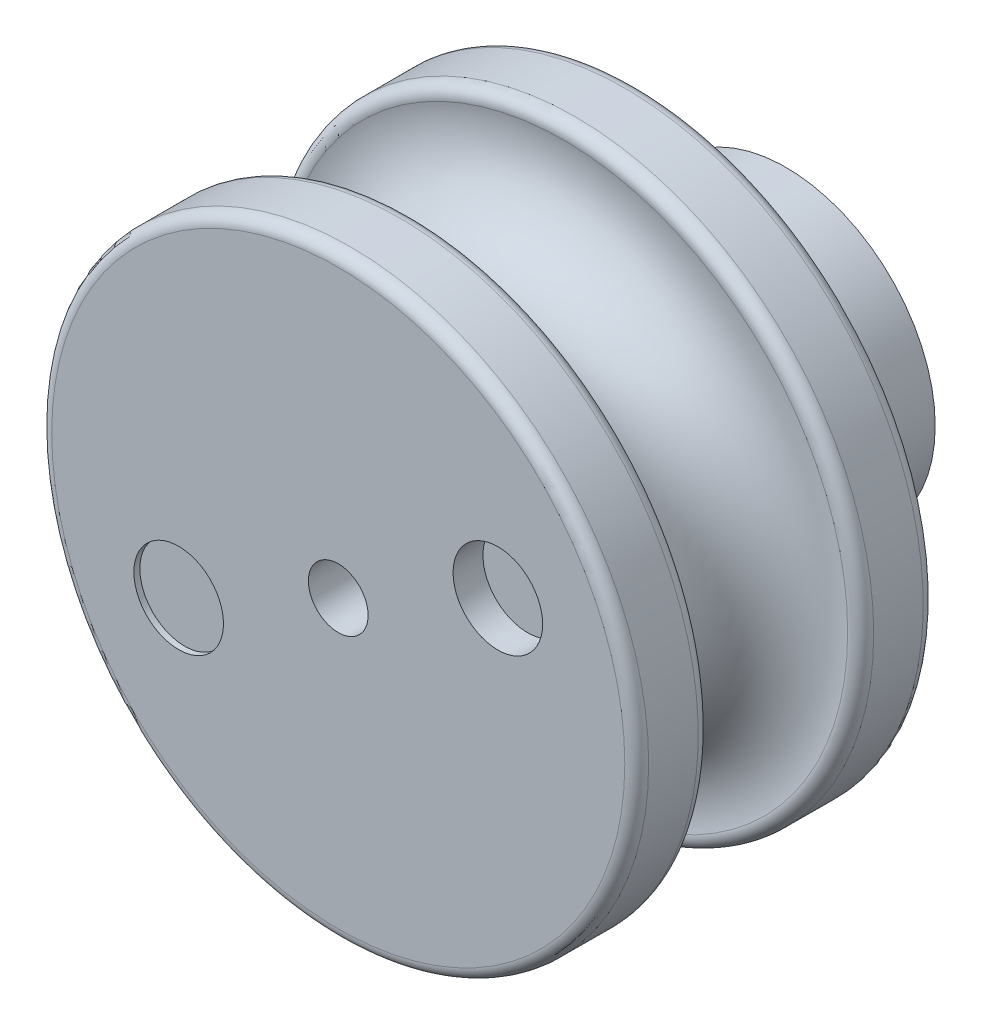
ISO-10303-21;
HEADER;
FILE_DESCRIPTION(('STEP AP214'),'2;1');
FILE_NAME('part.step','',(''),(''),'','','');
FILE_SCHEMA(('AUTOMOTIVE_DESIGN { 1 0 10303 214 1 1 1 1 }'));
ENDSEC;
DATA;
#1=APPLICATION_CONTEXT('core data for automotive mechanical design processes');
#2=APPLICATION_PROTOCOL_DEFINITION('international standard','automotive_design',2000,#1);
#3=PRODUCT_CONTEXT('',#1,'mechanical');
#4=PRODUCT('Part','Part','',(#3));
#5=PRODUCT_RELATED_PRODUCT_CATEGORY('part','',(#4));
#6=PRODUCT_DEFINITION_FORMATION('','',#4);
#7=PRODUCT_DEFINITION_CONTEXT('part definition',#1,'design');
#8=PRODUCT_DEFINITION('design','',#6,#7);
#9=PRODUCT_DEFINITION_SHAPE('','',#8);
#10=(LENGTH_UNIT() NAMED_UNIT(*) SI_UNIT(.MILLI.,.METRE.));
#11=(NAMED_UNIT(*) PLANE_ANGLE_UNIT() SI_UNIT($,.RADIAN.));
#12=(NAMED_UNIT(*) SI_UNIT($,.STERADIAN.) SOLID_ANGLE_UNIT());
#13=UNCERTAINTY_MEASURE_WITH_UNIT(LENGTH_MEASURE(1.E-05),#10,'distance_accuracy_value','');
#14=(GEOMETRIC_REPRESENTATION_CONTEXT(3) GLOBAL_UNCERTAINTY_ASSIGNED_CONTEXT((#13)) GLOBAL_UNIT_ASSIGNED_CONTEXT((#10,
#11,#12)) REPRESENTATION_CONTEXT('',''));
#15=CARTESIAN_POINT('',(0.,0.,0.));
#16=DIRECTION('',(0.,0.,1.));
#17=DIRECTION('',(1.,0.,0.));
#18=AXIS2_PLACEMENT_3D('',#15,#16,#17);
#19=CARTESIAN_POINT('',(0.,0.,-1.5));
#20=DIRECTION('',(0.,0.,1.));
#21=DIRECTION('',(1.,0.,0.));
#22=AXIS2_PLACEMENT_3D('',#19,#20,#21);
#23=CYLINDRICAL_SURFACE('',#22,2.5);
#24=CARTESIAN_POINT('',(0.,0.,0.));
#25=DIRECTION('',(0.,0.,1.));
#26=DIRECTION('',(1.,0.,0.));
#27=AXIS2_PLACEMENT_3D('',#24,#25,#26);
#28=CIRCLE('',#27,2.5);
#29=CARTESIAN_POINT('',(2.5,0.,0.));
#30=VERTEX_POINT('',#29);
#31=EDGE_CURVE('E179',#30,#30,#28,.T.);
#32=ORIENTED_EDGE('',*,*,#31,.F.);
#33=EDGE_LOOP('',(#32));
#34=FACE_BOUND('',#33,.T.);
#35=CARTESIAN_POINT('',(0.,0.,-2.5));
#36=DIRECTION('',(0.,0.,-1.));
#37=DIRECTION('',(-0.990268068741566,0.139173100960095,0.));
#38=AXIS2_PLACEMENT_3D('',#35,#36,#37);
#39=CIRCLE('',#38,2.5);
#40=CARTESIAN_POINT('',(-2.47567017185392,0.347932752400238,-2.5));
#41=VERTEX_POINT('',#40);
#42=EDGE_CURVE('E10',#41,#41,#39,.T.);
#43=ORIENTED_EDGE('',*,*,#42,.F.);
#44=EDGE_LOOP('',(#43));
#45=FACE_BOUND('',#44,.T.);
#46=ADVANCED_FACE('F16',(#34,#45),#23,.T.);
#47=CARTESIAN_POINT('',(0.,0.,-2.5));
#48=DIRECTION('',(0.,0.,-1.));
#49=DIRECTION('',(0.,-1.,0.));
#50=AXIS2_PLACEMENT_3D('',#47,#48,#49);
#51=PLANE('',#50);
#52=CARTESIAN_POINT('',(0.,0.,-2.5));
#53=DIRECTION('',(0.,0.,1.));
#54=DIRECTION('',(0.990268068741566,-0.139173100960095,0.));
#55=AXIS2_PLACEMENT_3D('',#52,#53,#54);
#56=CIRCLE('',#55,0.975);
#57=CARTESIAN_POINT('',(0.965511367023027,-0.135693773436093,-2.5));
#58=VERTEX_POINT('',#57);
#59=EDGE_CURVE('E24',#58,#58,#56,.T.);
#60=ORIENTED_EDGE('',*,*,#59,.T.);
#61=EDGE_LOOP('',(#60));
#62=FACE_BOUND('',#61,.T.);
#63=ORIENTED_EDGE('',*,*,#42,.T.);
#64=EDGE_LOOP('',(#63));
#65=FACE_BOUND('',#64,.T.);
#66=ADVANCED_FACE('F83',(#62,#65),#51,.T.);
#67=CARTESIAN_POINT('',(0.,0.,6.5));
#68=DIRECTION('',(0.,0.,-1.));
#69=DIRECTION('',(-1.,0.,0.));
#70=AXIS2_PLACEMENT_3D('',#67,#68,#69);
#71=CYLINDRICAL_SURFACE('',#70,0.975);
#72=ORIENTED_EDGE('',*,*,#59,.F.);
#73=EDGE_LOOP('',(#72));
#74=FACE_BOUND('',#73,.T.);
#75=CARTESIAN_POINT('',(0.,0.,3.));
#76=DIRECTION('',(0.,0.,-1.));
#77=DIRECTION('',(-1.,0.,0.));
#78=AXIS2_PLACEMENT_3D('',#75,#76,#77);
#79=CIRCLE('',#78,0.975);
#80=CARTESIAN_POINT('',(-0.975,0.,3.));
#81=VERTEX_POINT('',#80);
#82=EDGE_CURVE('E33',#81,#81,#79,.T.);
#83=ORIENTED_EDGE('',*,*,#82,.F.);
#84=EDGE_LOOP('',(#83));
#85=FACE_BOUND('',#84,.T.);
#86=ADVANCED_FACE('F18',(#74,#85),#71,.F.);
#87=CARTESIAN_POINT('',(0.,0.,3.));
#88=DIRECTION('',(0.,0.,1.));
#89=DIRECTION('',(1.,0.,0.));
#90=AXIS2_PLACEMENT_3D('',#87,#88,#89);
#91=PLANE('',#90);
#92=CARTESIAN_POINT('',(0.,0.,3.));
#93=DIRECTION('',(0.,0.,1.));
#94=DIRECTION('',(-1.,0.,0.));
#95=AXIS2_PLACEMENT_3D('',#92,#93,#94);
#96=CIRCLE('',#95,0.5);
#97=CARTESIAN_POINT('',(-0.5,0.,3.));
#98=VERTEX_POINT('',#97);
#99=EDGE_CURVE('E41',#98,#98,#96,.T.);
#100=ORIENTED_EDGE('',*,*,#99,.T.);
#101=EDGE_LOOP('',(#100));
#102=FACE_BOUND('',#101,.T.);
#103=ORIENTED_EDGE('',*,*,#82,.T.);
#104=EDGE_LOOP('',(#103));
#105=FACE_BOUND('',#104,.T.);
#106=ADVANCED_FACE('F65',(#102,#105),#91,.F.);
#107=CARTESIAN_POINT('',(0.,0.,4.));
#108=DIRECTION('',(0.,0.,1.));
#109=DIRECTION('',(1.,0.,0.));
#110=AXIS2_PLACEMENT_3D('',#107,#108,#109);
#111=CYLINDRICAL_SURFACE('',#110,0.5);
#112=CARTESIAN_POINT('',(0.,0.,5.));
#113=DIRECTION('',(0.,0.,-1.));
#114=DIRECTION('',(-1.,0.,0.));
#115=AXIS2_PLACEMENT_3D('',#112,#113,#114);
#116=CIRCLE('',#115,0.5);
#117=CARTESIAN_POINT('',(-0.5,0.,5.));
#118=VERTEX_POINT('',#117);
#119=EDGE_CURVE('E46',#118,#118,#116,.T.);
#120=ORIENTED_EDGE('',*,*,#119,.F.);
#121=EDGE_LOOP('',(#120));
#122=FACE_BOUND('',#121,.T.);
#123=ORIENTED_EDGE('',*,*,#99,.F.);
#124=EDGE_LOOP('',(#123));
#125=FACE_BOUND('',#124,.T.);
#126=ADVANCED_FACE('F68',(#122,#125),#111,.F.);
#127=CARTESIAN_POINT('',(2.673446241719,1.333878800344,4.5));
#128=DIRECTION('',(0.,0.,1.));
#129=DIRECTION('',(1.,0.,0.));
#130=AXIS2_PLACEMENT_3D('',#127,#128,#129);
#131=PLANE('',#130);
#132=CARTESIAN_POINT('',(2.673446241719,1.333878800344,4.5));
#133=DIRECTION('',(0.,0.,1.));
#134=DIRECTION('',(0.990268068741566,-0.139173100960095,0.));
#135=AXIS2_PLACEMENT_3D('',#132,#133,#134);
#136=CIRCLE('',#135,0.75);
#137=CARTESIAN_POINT('',(3.41614729327517,1.22949897462393,4.5));
#138=VERTEX_POINT('',#137);
#139=EDGE_CURVE('E54',#138,#138,#136,.T.);
#140=ORIENTED_EDGE('',*,*,#139,.T.);
#141=EDGE_LOOP('',(#140));
#142=FACE_BOUND('',#141,.T.);
#143=ADVANCED_FACE('F70',(#142),#131,.T.);
#144=CARTESIAN_POINT('',(2.673446241719,1.333878800344,4.5));
#145=DIRECTION('',(0.,0.,1.));
#146=DIRECTION('',(1.,0.,0.));
#147=AXIS2_PLACEMENT_3D('',#144,#145,#146);
#148=CYLINDRICAL_SURFACE('',#147,0.75);
#149=CARTESIAN_POINT('',(2.673446241719,1.333878800344,5.));
#150=DIRECTION('',(0.,0.,-1.));
#151=DIRECTION('',(-1.,0.,0.));
#152=AXIS2_PLACEMENT_3D('',#149,#150,#151);
#153=CIRCLE('',#152,0.75);
#154=CARTESIAN_POINT('',(1.923446241719,1.333878800344,5.));
#155=VERTEX_POINT('',#154);
#156=EDGE_CURVE('E142',#155,#155,#153,.T.);
#157=ORIENTED_EDGE('',*,*,#156,.F.);
#158=EDGE_LOOP('',(#157));
#159=FACE_BOUND('',#158,.T.);
#160=ORIENTED_EDGE('',*,*,#139,.F.);
#161=EDGE_LOOP('',(#160));
#162=FACE_BOUND('',#161,.T.);
#163=ADVANCED_FACE('F78',(#159,#162),#148,.F.);
#164=CARTESIAN_POINT('',(-2.673446241719,-1.333878800344,4.9));
#165=DIRECTION('',(0.,0.,1.));
#166=DIRECTION('',(1.,0.,0.));
#167=AXIS2_PLACEMENT_3D('',#164,#165,#166);
#168=PLANE('',#167);
#169=CARTESIAN_POINT('',(-2.673446241719,-1.333878800344,4.9));
#170=DIRECTION('',(0.,0.,1.));
#171=DIRECTION('',(-1.,0.,0.));
#172=AXIS2_PLACEMENT_3D('',#169,#170,#171);
#173=CIRCLE('',#172,0.75);
#174=CARTESIAN_POINT('',(-3.423446241719,-1.333878800344,4.9));
#175=VERTEX_POINT('',#174);
#176=EDGE_CURVE('E50',#175,#175,#173,.T.);
#177=ORIENTED_EDGE('',*,*,#176,.T.);
#178=EDGE_LOOP('',(#177));
#179=FACE_BOUND('',#178,.T.);
#180=ADVANCED_FACE('F130',(#179),#168,.T.);
#181=CARTESIAN_POINT('',(-2.673446241719,-1.333878800344,4.9));
#182=DIRECTION('',(0.,0.,1.));
#183=DIRECTION('',(1.,0.,0.));
#184=AXIS2_PLACEMENT_3D('',#181,#182,#183);
#185=CYLINDRICAL_SURFACE('',#184,0.75);
#186=CARTESIAN_POINT('',(-2.673446241719,-1.333878800344,5.));
#187=DIRECTION('',(0.,0.,-1.));
#188=DIRECTION('',(-1.,0.,0.));
#189=AXIS2_PLACEMENT_3D('',#186,#187,#188);
#190=CIRCLE('',#189,0.75);
#191=CARTESIAN_POINT('',(-3.423446241719,-1.333878800344,5.));
#192=VERTEX_POINT('',#191);
#193=EDGE_CURVE('E44',#192,#192,#190,.T.);
#194=ORIENTED_EDGE('',*,*,#193,.F.);
#195=EDGE_LOOP('',(#194));
#196=FACE_BOUND('',#195,.T.);
#197=ORIENTED_EDGE('',*,*,#176,.F.);
#198=EDGE_LOOP('',(#197));
#199=FACE_BOUND('',#198,.T.);
#200=ADVANCED_FACE('F126',(#196,#199),#185,.F.);
#201=CARTESIAN_POINT('',(0.,0.,5.));
#202=DIRECTION('',(0.,0.,1.));
#203=DIRECTION('',(1.,0.,0.));
#204=AXIS2_PLACEMENT_3D('',#201,#202,#203);
#205=PLANE('',#204);
#206=ORIENTED_EDGE('',*,*,#119,.T.);
#207=EDGE_LOOP('',(#206));
#208=FACE_BOUND('',#207,.T.);
#209=ORIENTED_EDGE('',*,*,#193,.T.);
#210=EDGE_LOOP('',(#209));
#211=FACE_BOUND('',#210,.T.);
#212=ORIENTED_EDGE('',*,*,#156,.T.);
#213=EDGE_LOOP('',(#212));
#214=FACE_BOUND('',#213,.T.);
#215=CARTESIAN_POINT('',(0.,0.,5.));
#216=DIRECTION('',(0.,0.,1.));
#217=DIRECTION('',(-1.,0.,0.));
#218=AXIS2_PLACEMENT_3D('',#215,#216,#217);
#219=CIRCLE('',#218,4.8);
#220=CARTESIAN_POINT('',(-4.8,0.,5.));
#221=VERTEX_POINT('',#220);
#222=EDGE_CURVE('E146',#221,#221,#219,.T.);
#223=ORIENTED_EDGE('',*,*,#222,.T.);
#224=EDGE_LOOP('',(#223));
#225=FACE_BOUND('',#224,.T.);
#226=ADVANCED_FACE('F122',(#208,#211,#214,#225),#205,.T.);
#227=CARTESIAN_POINT('',(0.,0.,4.8));
#228=DIRECTION('',(0.,0.,1.));
#229=DIRECTION('',(1.,0.,0.));
#230=AXIS2_PLACEMENT_3D('',#227,#228,#229);
#231=TOROIDAL_SURFACE('',#230,4.8,0.2);
#232=CARTESIAN_POINT('',(0.,0.,4.8));
#233=DIRECTION('',(0.,0.,1.));
#234=DIRECTION('',(1.,0.,0.));
#235=AXIS2_PLACEMENT_3D('',#232,#233,#234);
#236=CIRCLE('',#235,5.);
#237=CARTESIAN_POINT('',(5.,0.,4.8));
#238=VERTEX_POINT('',#237);
#239=EDGE_CURVE('E153',#238,#238,#236,.T.);
#240=ORIENTED_EDGE('',*,*,#239,.T.);
#241=EDGE_LOOP('',(#240));
#242=FACE_BOUND('',#241,.T.);
#243=ORIENTED_EDGE('',*,*,#222,.F.);
#244=EDGE_LOOP('',(#243));
#245=FACE_BOUND('',#244,.T.);
#246=ADVANCED_FACE('F112',(#242,#245),#231,.T.);
#247=CARTESIAN_POINT('',(0.,0.,5.));
#248=DIRECTION('',(0.,0.,-1.));
#249=DIRECTION('',(-1.,0.,0.));
#250=AXIS2_PLACEMENT_3D('',#247,#248,#249);
#251=CYLINDRICAL_SURFACE('',#250,5.);
#252=CARTESIAN_POINT('',(0.,0.,3.96969384567));
#253=DIRECTION('',(0.,0.,-1.));
#254=DIRECTION('',(-1.,0.,0.));
#255=AXIS2_PLACEMENT_3D('',#252,#253,#254);
#256=CIRCLE('',#255,5.);
#257=CARTESIAN_POINT('',(-5.,0.,3.96969384567));
#258=VERTEX_POINT('',#257);
#259=EDGE_CURVE('E156',#258,#258,#256,.T.);
#260=ORIENTED_EDGE('',*,*,#259,.F.);
#261=EDGE_LOOP('',(#260));
#262=FACE_BOUND('',#261,.T.);
#263=ORIENTED_EDGE('',*,*,#239,.F.);
#264=EDGE_LOOP('',(#263));
#265=FACE_BOUND('',#264,.T.);
#266=ADVANCED_FACE('F108',(#262,#265),#251,.T.);
#267=CARTESIAN_POINT('',(0.,0.,3.96969384567));
#268=DIRECTION('',(0.,0.,-1.));
#269=DIRECTION('',(-1.,0.,0.));
#270=AXIS2_PLACEMENT_3D('',#267,#268,#269);
#271=TOROIDAL_SURFACE('',#270,4.8,0.2);
#272=CARTESIAN_POINT('',(0.,0.,3.773734666247));
#273=DIRECTION('',(0.,0.,-1.));
#274=DIRECTION('',(1.,0.,0.));
#275=AXIS2_PLACEMENT_3D('',#272,#273,#274);
#276=CIRCLE('',#275,4.76);
#277=CARTESIAN_POINT('',(4.76,0.,3.773734666247));
#278=VERTEX_POINT('',#277);
#279=EDGE_CURVE('E160',#278,#278,#276,.T.);
#280=ORIENTED_EDGE('',*,*,#279,.F.);
#281=EDGE_LOOP('',(#280));
#282=FACE_BOUND('',#281,.T.);
#283=ORIENTED_EDGE('',*,*,#259,.T.);
#284=EDGE_LOOP('',(#283));
#285=FACE_BOUND('',#284,.T.);
#286=ADVANCED_FACE('F111',(#282,#285),#271,.T.);
#287=CARTESIAN_POINT('',(0.,0.,2.5));
#288=DIRECTION('',(0.,0.,-1.));
#289=DIRECTION('',(-1.,0.,0.));
#290=AXIS2_PLACEMENT_3D('',#287,#288,#289);
#291=TOROIDAL_SURFACE('',#290,4.5,1.3);
#292=CARTESIAN_POINT('',(0.,0.,1.226265333753));
#293=DIRECTION('',(0.,0.,1.));
#294=DIRECTION('',(1.,0.,0.));
#295=AXIS2_PLACEMENT_3D('',#292,#293,#294);
#296=CIRCLE('',#295,4.76);
#297=CARTESIAN_POINT('',(4.76,0.,1.226265333753));
#298=VERTEX_POINT('',#297);
#299=EDGE_CURVE('E164',#298,#298,#296,.T.);
#300=ORIENTED_EDGE('',*,*,#299,.T.);
#301=EDGE_LOOP('',(#300));
#302=FACE_BOUND('',#301,.T.);
#303=ORIENTED_EDGE('',*,*,#279,.T.);
#304=EDGE_LOOP('',(#303));
#305=FACE_BOUND('',#304,.T.);
#306=ADVANCED_FACE('F99',(#302,#305),#291,.F.);
#307=CARTESIAN_POINT('',(0.,0.,1.03030615433));
#308=DIRECTION('',(0.,0.,1.));
#309=DIRECTION('',(1.,0.,0.));
#310=AXIS2_PLACEMENT_3D('',#307,#308,#309);
#311=TOROIDAL_SURFACE('',#310,4.8,0.2);
#312=CARTESIAN_POINT('',(0.,0.,1.03030615433));
#313=DIRECTION('',(0.,0.,1.));
#314=DIRECTION('',(1.,0.,0.));
#315=AXIS2_PLACEMENT_3D('',#312,#313,#314);
#316=CIRCLE('',#315,5.);
#317=CARTESIAN_POINT('',(5.,0.,1.03030615433));
#318=VERTEX_POINT('',#317);
#319=EDGE_CURVE('E171',#318,#318,#316,.T.);
#320=ORIENTED_EDGE('',*,*,#319,.T.);
#321=EDGE_LOOP('',(#320));
#322=FACE_BOUND('',#321,.T.);
#323=ORIENTED_EDGE('',*,*,#299,.F.);
#324=EDGE_LOOP('',(#323));
#325=FACE_BOUND('',#324,.T.);
#326=ADVANCED_FACE('F95',(#322,#325),#311,.T.);
#327=CARTESIAN_POINT('',(0.,0.,5.));
#328=DIRECTION('',(0.,0.,-1.));
#329=DIRECTION('',(-1.,0.,0.));
#330=AXIS2_PLACEMENT_3D('',#327,#328,#329);
#331=CYLINDRICAL_SURFACE('',#330,5.);
#332=CARTESIAN_POINT('',(0.,0.,0.2));
#333=DIRECTION('',(0.,0.,-1.));
#334=DIRECTION('',(-1.,0.,0.));
#335=AXIS2_PLACEMENT_3D('',#332,#333,#334);
#336=CIRCLE('',#335,5.);
#337=CARTESIAN_POINT('',(-5.,0.,0.2));
#338=VERTEX_POINT('',#337);
#339=EDGE_CURVE('E175',#338,#338,#336,.T.);
#340=ORIENTED_EDGE('',*,*,#339,.F.);
#341=EDGE_LOOP('',(#340));
#342=FACE_BOUND('',#341,.T.);
#343=ORIENTED_EDGE('',*,*,#319,.F.);
#344=EDGE_LOOP('',(#343));
#345=FACE_BOUND('',#344,.T.);
#346=ADVANCED_FACE('F98',(#342,#345),#331,.T.);
#347=CARTESIAN_POINT('',(0.,0.,0.2));
#348=DIRECTION('',(0.,0.,1.));
#349=DIRECTION('',(1.,0.,0.));
#350=AXIS2_PLACEMENT_3D('',#347,#348,#349);
#351=TOROIDAL_SURFACE('',#350,4.8,0.2);
#352=CARTESIAN_POINT('',(0.,0.,0.));
#353=DIRECTION('',(0.,0.,-1.));
#354=DIRECTION('',(-1.,0.,0.));
#355=AXIS2_PLACEMENT_3D('',#352,#353,#354);
#356=CIRCLE('',#355,4.8);
#357=CARTESIAN_POINT('',(-4.8,0.,0.));
#358=VERTEX_POINT('',#357);
#359=EDGE_CURVE('E183',#358,#358,#356,.T.);
#360=ORIENTED_EDGE('',*,*,#359,.F.);
#361=EDGE_LOOP('',(#360));
#362=FACE_BOUND('',#361,.T.);
#363=ORIENTED_EDGE('',*,*,#339,.T.);
#364=EDGE_LOOP('',(#363));
#365=FACE_BOUND('',#364,.T.);
#366=ADVANCED_FACE('F101',(#362,#365),#351,.T.);
#367=CARTESIAN_POINT('',(0.,0.,0.));
#368=DIRECTION('',(0.,0.,1.));
#369=DIRECTION('',(1.,0.,0.));
#370=AXIS2_PLACEMENT_3D('',#367,#368,#369);
#371=PLANE('',#370);
#372=ORIENTED_EDGE('',*,*,#31,.T.);
#373=EDGE_LOOP('',(#372));
#374=FACE_BOUND('',#373,.T.);
#375=ORIENTED_EDGE('',*,*,#359,.T.);
#376=EDGE_LOOP('',(#375));
#377=FACE_BOUND('',#376,.T.);
#378=ADVANCED_FACE('F94',(#374,#377),#371,.F.);
#379=CLOSED_SHELL('',(#46,#66,#86,#106,#126,#143,#163,#180,#200,#226,#246,#266,#286,#306,#326,
#346,#366,#378));
#380=MANIFOLD_SOLID_BREP('B1',#379);
#381=ADVANCED_BREP_SHAPE_REPRESENTATION('',(#18,#380),#14);
#382=SHAPE_DEFINITION_REPRESENTATION(#9,#381);
ENDSEC;
END-ISO-10303-21;
